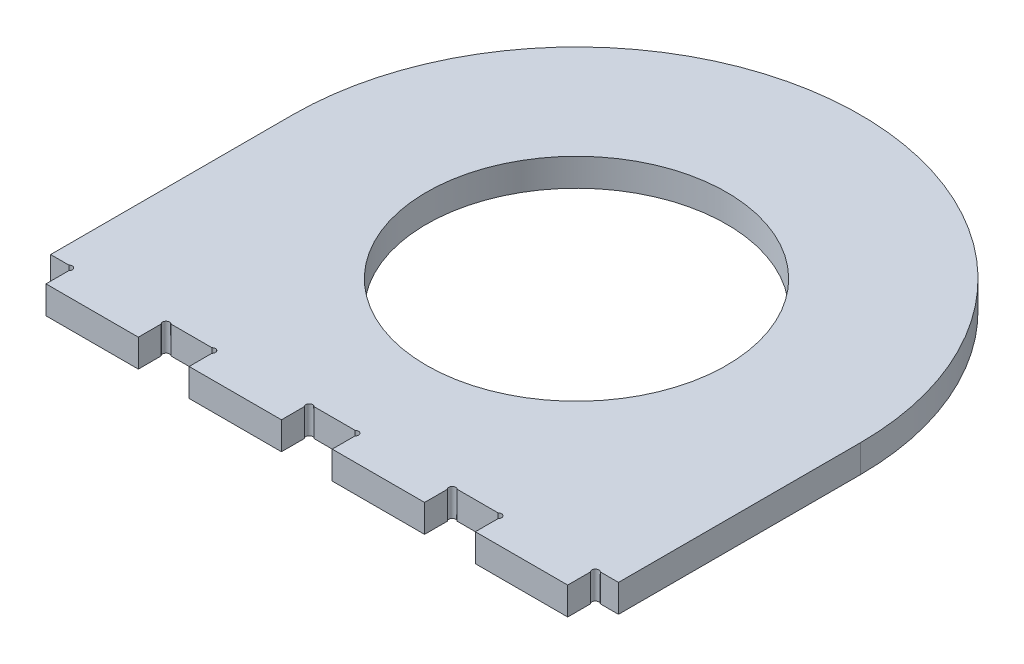
ISO-10303-21;
HEADER;
FILE_DESCRIPTION(('STEP AP214'),'2;1');
FILE_NAME('part.step','',(''),(''),'','','');
FILE_SCHEMA(('AUTOMOTIVE_DESIGN { 1 0 10303 214 1 1 1 1 }'));
ENDSEC;
DATA;
#1=APPLICATION_CONTEXT('core data for automotive mechanical design processes');
#2=APPLICATION_PROTOCOL_DEFINITION('international standard','automotive_design',2000,#1);
#3=PRODUCT_CONTEXT('',#1,'mechanical');
#4=PRODUCT('Part','Part','',(#3));
#5=PRODUCT_RELATED_PRODUCT_CATEGORY('part','',(#4));
#6=PRODUCT_DEFINITION_FORMATION('','',#4);
#7=PRODUCT_DEFINITION_CONTEXT('part definition',#1,'design');
#8=PRODUCT_DEFINITION('design','',#6,#7);
#9=PRODUCT_DEFINITION_SHAPE('','',#8);
#10=(LENGTH_UNIT() NAMED_UNIT(*) SI_UNIT(.MILLI.,.METRE.));
#11=(NAMED_UNIT(*) PLANE_ANGLE_UNIT() SI_UNIT($,.RADIAN.));
#12=(NAMED_UNIT(*) SI_UNIT($,.STERADIAN.) SOLID_ANGLE_UNIT());
#13=UNCERTAINTY_MEASURE_WITH_UNIT(LENGTH_MEASURE(1.E-05),#10,'distance_accuracy_value','');
#14=(GEOMETRIC_REPRESENTATION_CONTEXT(3) GLOBAL_UNCERTAINTY_ASSIGNED_CONTEXT((#13)) GLOBAL_UNIT_ASSIGNED_CONTEXT((#10,
#11,#12)) REPRESENTATION_CONTEXT('',''));
#15=CARTESIAN_POINT('',(0.,0.,0.));
#16=DIRECTION('',(0.,0.,1.));
#17=DIRECTION('',(1.,0.,0.));
#18=AXIS2_PLACEMENT_3D('',#15,#16,#17);
#19=CARTESIAN_POINT('',(180.,12.,-104.820295073944));
#20=DIRECTION('',(0.,1.,0.));
#21=DIRECTION('',(0.,0.,1.));
#22=AXIS2_PLACEMENT_3D('',#19,#20,#21);
#23=PLANE('',#22);
#24=DIRECTION('',(0.,0.,-1.));
#25=VECTOR('',#24,1.);
#26=CARTESIAN_POINT('',(303.,12.,0.));
#27=LINE('',#26,#25);
#28=CARTESIAN_POINT('',(303.,12.,0.));
#29=VERTEX_POINT('',#28);
#30=CARTESIAN_POINT('',(303.,12.,-104.820295073944));
#31=VERTEX_POINT('',#30);
#32=EDGE_CURVE('E304',#29,#31,#27,.T.);
#33=ORIENTED_EDGE('',*,*,#32,.T.);
#34=CARTESIAN_POINT('',(180.,12.,-104.820295073944));
#35=DIRECTION('',(0.,1.,0.));
#36=DIRECTION('',(0.,0.,1.));
#37=AXIS2_PLACEMENT_3D('',#34,#35,#36);
#38=CIRCLE('',#37,123.);
#39=CARTESIAN_POINT('',(57.,12.,-104.820295073944));
#40=VERTEX_POINT('',#39);
#41=EDGE_CURVE('E152',#31,#40,#38,.T.);
#42=ORIENTED_EDGE('',*,*,#41,.T.);
#43=DIRECTION('',(0.,0.,1.));
#44=VECTOR('',#43,1.);
#45=CARTESIAN_POINT('',(57.,12.,0.));
#46=LINE('',#45,#44);
#47=CARTESIAN_POINT('',(57.,12.,0.));
#48=VERTEX_POINT('',#47);
#49=EDGE_CURVE('E379',#40,#48,#46,.T.);
#50=ORIENTED_EDGE('',*,*,#49,.T.);
#51=DIRECTION('',(1.,0.,0.));
#52=VECTOR('',#51,1.);
#53=CARTESIAN_POINT('',(57.,12.,0.));
#54=LINE('',#53,#52);
#55=CARTESIAN_POINT('',(64.8786796564404,12.,0.));
#56=VERTEX_POINT('',#55);
#57=EDGE_CURVE('E398',#48,#56,#54,.T.);
#58=ORIENTED_EDGE('',*,*,#57,.T.);
#59=CARTESIAN_POINT('',(65.9393398282202,12.,1.06066017177982));
#60=DIRECTION('',(0.,-1.,0.));
#61=DIRECTION('',(0.,0.,1.));
#62=AXIS2_PLACEMENT_3D('',#59,#60,#61);
#63=CIRCLE('',#62,1.5);
#64=CARTESIAN_POINT('',(67.,12.,2.12132034355964));
#65=VERTEX_POINT('',#64);
#66=EDGE_CURVE('E395',#56,#65,#63,.T.);
#67=ORIENTED_EDGE('',*,*,#66,.T.);
#68=DIRECTION('',(0.,0.,1.));
#69=VECTOR('',#68,1.);
#70=CARTESIAN_POINT('',(67.,12.,2.12132034355964));
#71=LINE('',#70,#69);
#72=CARTESIAN_POINT('',(67.,12.,12.));
#73=VERTEX_POINT('',#72);
#74=EDGE_CURVE('E397',#65,#73,#71,.T.);
#75=ORIENTED_EDGE('',*,*,#74,.T.);
#76=DIRECTION('',(1.,0.,0.));
#77=VECTOR('',#76,1.);
#78=CARTESIAN_POINT('',(67.,12.,12.));
#79=LINE('',#78,#77);
#80=CARTESIAN_POINT('',(107.,12.,12.));
#81=VERTEX_POINT('',#80);
#82=EDGE_CURVE('E400',#73,#81,#79,.T.);
#83=ORIENTED_EDGE('',*,*,#82,.T.);
#84=DIRECTION('',(0.,0.,-1.));
#85=VECTOR('',#84,1.);
#86=CARTESIAN_POINT('',(107.,12.,12.));
#87=LINE('',#86,#85);
#88=CARTESIAN_POINT('',(107.,12.,2.12132034355962));
#89=VERTEX_POINT('',#88);
#90=EDGE_CURVE('E406',#81,#89,#87,.T.);
#91=ORIENTED_EDGE('',*,*,#90,.T.);
#92=CARTESIAN_POINT('',(108.06066017178,12.,1.06066017177981));
#93=DIRECTION('',(0.,-1.,0.));
#94=DIRECTION('',(0.,0.,1.));
#95=AXIS2_PLACEMENT_3D('',#92,#93,#94);
#96=CIRCLE('',#95,1.5);
#97=CARTESIAN_POINT('',(109.12132034356,12.,0.));
#98=VERTEX_POINT('',#97);
#99=EDGE_CURVE('E408',#89,#98,#96,.T.);
#100=ORIENTED_EDGE('',*,*,#99,.T.);
#101=DIRECTION('',(1.,0.,0.));
#102=VECTOR('',#101,1.);
#103=CARTESIAN_POINT('',(109.12132034356,12.,0.));
#104=LINE('',#103,#102);
#105=CARTESIAN_POINT('',(126.87867965644,12.,0.));
#106=VERTEX_POINT('',#105);
#107=EDGE_CURVE('E410',#98,#106,#104,.T.);
#108=ORIENTED_EDGE('',*,*,#107,.T.);
#109=CARTESIAN_POINT('',(127.93933982822,12.,1.06066017177981));
#110=DIRECTION('',(0.,-1.,0.));
#111=DIRECTION('',(0.,0.,1.));
#112=AXIS2_PLACEMENT_3D('',#109,#110,#111);
#113=CIRCLE('',#112,1.49999999999996);
#114=CARTESIAN_POINT('',(129.,12.,2.1213203435596));
#115=VERTEX_POINT('',#114);
#116=EDGE_CURVE('E412',#106,#115,#113,.T.);
#117=ORIENTED_EDGE('',*,*,#116,.T.);
#118=DIRECTION('',(0.,0.,1.));
#119=VECTOR('',#118,1.);
#120=CARTESIAN_POINT('',(129.,12.,2.1213203435596));
#121=LINE('',#120,#119);
#122=CARTESIAN_POINT('',(129.,12.,12.));
#123=VERTEX_POINT('',#122);
#124=EDGE_CURVE('E414',#115,#123,#121,.T.);
#125=ORIENTED_EDGE('',*,*,#124,.T.);
#126=DIRECTION('',(1.,0.,0.));
#127=VECTOR('',#126,1.);
#128=CARTESIAN_POINT('',(129.,12.,12.));
#129=LINE('',#128,#127);
#130=CARTESIAN_POINT('',(169.,12.,12.));
#131=VERTEX_POINT('',#130);
#132=EDGE_CURVE('E416',#123,#131,#129,.T.);
#133=ORIENTED_EDGE('',*,*,#132,.T.);
#134=DIRECTION('',(0.,0.,-1.));
#135=VECTOR('',#134,1.);
#136=CARTESIAN_POINT('',(169.,12.,12.));
#137=LINE('',#136,#135);
#138=CARTESIAN_POINT('',(169.,12.,2.12132034355962));
#139=VERTEX_POINT('',#138);
#140=EDGE_CURVE('E418',#131,#139,#137,.T.);
#141=ORIENTED_EDGE('',*,*,#140,.T.);
#142=CARTESIAN_POINT('',(170.06066017178,12.,1.06066017177981));
#143=DIRECTION('',(0.,-1.,0.));
#144=DIRECTION('',(0.,0.,1.));
#145=AXIS2_PLACEMENT_3D('',#142,#143,#144);
#146=CIRCLE('',#145,1.5);
#147=CARTESIAN_POINT('',(171.12132034356,12.,0.));
#148=VERTEX_POINT('',#147);
#149=EDGE_CURVE('E420',#139,#148,#146,.T.);
#150=ORIENTED_EDGE('',*,*,#149,.T.);
#151=DIRECTION('',(1.,0.,0.));
#152=VECTOR('',#151,1.);
#153=CARTESIAN_POINT('',(171.12132034356,12.,0.));
#154=LINE('',#153,#152);
#155=CARTESIAN_POINT('',(188.87867965644,12.,0.));
#156=VERTEX_POINT('',#155);
#157=EDGE_CURVE('E422',#148,#156,#154,.T.);
#158=ORIENTED_EDGE('',*,*,#157,.T.);
#159=CARTESIAN_POINT('',(189.93933982822,12.,1.06066017177981));
#160=DIRECTION('',(0.,-1.,0.));
#161=DIRECTION('',(0.,0.,1.));
#162=AXIS2_PLACEMENT_3D('',#159,#160,#161);
#163=CIRCLE('',#162,1.49999999999996);
#164=CARTESIAN_POINT('',(191.,12.,2.1213203435596));
#165=VERTEX_POINT('',#164);
#166=EDGE_CURVE('E424',#156,#165,#163,.T.);
#167=ORIENTED_EDGE('',*,*,#166,.T.);
#168=DIRECTION('',(0.,0.,1.));
#169=VECTOR('',#168,1.);
#170=CARTESIAN_POINT('',(191.,12.,2.1213203435596));
#171=LINE('',#170,#169);
#172=CARTESIAN_POINT('',(191.,12.,12.));
#173=VERTEX_POINT('',#172);
#174=EDGE_CURVE('E426',#165,#173,#171,.T.);
#175=ORIENTED_EDGE('',*,*,#174,.T.);
#176=DIRECTION('',(1.,0.,0.));
#177=VECTOR('',#176,1.);
#178=CARTESIAN_POINT('',(191.,12.,12.));
#179=LINE('',#178,#177);
#180=CARTESIAN_POINT('',(231.,12.,12.));
#181=VERTEX_POINT('',#180);
#182=EDGE_CURVE('E428',#173,#181,#179,.T.);
#183=ORIENTED_EDGE('',*,*,#182,.T.);
#184=DIRECTION('',(0.,0.,-1.));
#185=VECTOR('',#184,1.);
#186=CARTESIAN_POINT('',(231.,12.,12.));
#187=LINE('',#186,#185);
#188=CARTESIAN_POINT('',(231.,12.,2.12132034355962));
#189=VERTEX_POINT('',#188);
#190=EDGE_CURVE('E430',#181,#189,#187,.T.);
#191=ORIENTED_EDGE('',*,*,#190,.T.);
#192=CARTESIAN_POINT('',(232.06066017178,12.,1.06066017177981));
#193=DIRECTION('',(0.,-1.,0.));
#194=DIRECTION('',(0.,0.,1.));
#195=AXIS2_PLACEMENT_3D('',#192,#193,#194);
#196=CIRCLE('',#195,1.5);
#197=CARTESIAN_POINT('',(233.12132034356,12.,0.));
#198=VERTEX_POINT('',#197);
#199=EDGE_CURVE('E432',#189,#198,#196,.T.);
#200=ORIENTED_EDGE('',*,*,#199,.T.);
#201=DIRECTION('',(1.,0.,0.));
#202=VECTOR('',#201,1.);
#203=CARTESIAN_POINT('',(233.12132034356,12.,0.));
#204=LINE('',#203,#202);
#205=CARTESIAN_POINT('',(250.87867965644,12.,0.));
#206=VERTEX_POINT('',#205);
#207=EDGE_CURVE('E434',#198,#206,#204,.T.);
#208=ORIENTED_EDGE('',*,*,#207,.T.);
#209=CARTESIAN_POINT('',(251.93933982822,12.,1.06066017177981));
#210=DIRECTION('',(0.,-1.,0.));
#211=DIRECTION('',(0.,0.,1.));
#212=AXIS2_PLACEMENT_3D('',#209,#210,#211);
#213=CIRCLE('',#212,1.49999999999997);
#214=CARTESIAN_POINT('',(253.,12.,2.1213203435596));
#215=VERTEX_POINT('',#214);
#216=EDGE_CURVE('E436',#206,#215,#213,.T.);
#217=ORIENTED_EDGE('',*,*,#216,.T.);
#218=DIRECTION('',(0.,0.,1.));
#219=VECTOR('',#218,1.);
#220=CARTESIAN_POINT('',(253.,12.,2.1213203435596));
#221=LINE('',#220,#219);
#222=CARTESIAN_POINT('',(253.,12.,12.));
#223=VERTEX_POINT('',#222);
#224=EDGE_CURVE('E438',#215,#223,#221,.T.);
#225=ORIENTED_EDGE('',*,*,#224,.T.);
#226=DIRECTION('',(1.,0.,0.));
#227=VECTOR('',#226,1.);
#228=CARTESIAN_POINT('',(253.,12.,12.));
#229=LINE('',#228,#227);
#230=CARTESIAN_POINT('',(293.,12.,12.));
#231=VERTEX_POINT('',#230);
#232=EDGE_CURVE('E231',#223,#231,#229,.T.);
#233=ORIENTED_EDGE('',*,*,#232,.T.);
#234=DIRECTION('',(0.,0.,-1.));
#235=VECTOR('',#234,1.);
#236=CARTESIAN_POINT('',(293.,12.,12.));
#237=LINE('',#236,#235);
#238=CARTESIAN_POINT('',(293.,12.,2.12132034355962));
#239=VERTEX_POINT('',#238);
#240=EDGE_CURVE('E225',#231,#239,#237,.T.);
#241=ORIENTED_EDGE('',*,*,#240,.T.);
#242=CARTESIAN_POINT('',(294.06066017178,12.,1.06066017177981));
#243=DIRECTION('',(0.,-1.,0.));
#244=DIRECTION('',(0.,0.,1.));
#245=AXIS2_PLACEMENT_3D('',#242,#243,#244);
#246=CIRCLE('',#245,1.50000000000002);
#247=CARTESIAN_POINT('',(295.12132034356,12.,0.));
#248=VERTEX_POINT('',#247);
#249=EDGE_CURVE('E229',#239,#248,#246,.T.);
#250=ORIENTED_EDGE('',*,*,#249,.T.);
#251=DIRECTION('',(1.,0.,0.));
#252=VECTOR('',#251,1.);
#253=CARTESIAN_POINT('',(295.12132034356,12.,0.));
#254=LINE('',#253,#252);
#255=EDGE_CURVE('E49',#248,#29,#254,.T.);
#256=ORIENTED_EDGE('',*,*,#255,.T.);
#257=EDGE_LOOP('',(#33,#42,#50,#58,#67,#75,#83,#91,#100,#108,#117,#125,#133,#141,#150,#158,#167,
#175,#183,#191,#200,#208,#217,#225,#233,#241,#250,#256));
#258=FACE_BOUND('',#257,.T.);
#259=CARTESIAN_POINT('',(180.,12.,-104.820295073944));
#260=DIRECTION('',(0.,1.,0.));
#261=DIRECTION('',(0.,0.,1.));
#262=AXIS2_PLACEMENT_3D('',#259,#260,#261);
#263=CIRCLE('',#262,65.);
#264=CARTESIAN_POINT('',(180.,12.,-39.8202950739442));
#265=VERTEX_POINT('',#264);
#266=EDGE_CURVE('E253',#265,#265,#263,.T.);
#267=ORIENTED_EDGE('',*,*,#266,.F.);
#268=EDGE_LOOP('',(#267));
#269=FACE_BOUND('',#268,.T.);
#270=ADVANCED_FACE('F32',(#258,#269),#23,.T.);
#271=CARTESIAN_POINT('',(180.,0.,-104.820295073944));
#272=DIRECTION('',(0.,1.,0.));
#273=DIRECTION('',(0.,0.,1.));
#274=AXIS2_PLACEMENT_3D('',#271,#272,#273);
#275=PLANE('',#274);
#276=DIRECTION('',(0.,0.,-1.));
#277=VECTOR('',#276,1.);
#278=CARTESIAN_POINT('',(303.,0.,0.));
#279=LINE('',#278,#277);
#280=CARTESIAN_POINT('',(303.,0.,0.));
#281=VERTEX_POINT('',#280);
#282=CARTESIAN_POINT('',(303.,0.,-104.820295073944));
#283=VERTEX_POINT('',#282);
#284=EDGE_CURVE('E249',#281,#283,#279,.T.);
#285=ORIENTED_EDGE('',*,*,#284,.F.);
#286=DIRECTION('',(1.,0.,0.));
#287=VECTOR('',#286,1.);
#288=CARTESIAN_POINT('',(295.12132034356,0.,0.));
#289=LINE('',#288,#287);
#290=CARTESIAN_POINT('',(295.12132034356,0.,0.));
#291=VERTEX_POINT('',#290);
#292=EDGE_CURVE('E144',#291,#281,#289,.T.);
#293=ORIENTED_EDGE('',*,*,#292,.F.);
#294=CARTESIAN_POINT('',(294.06066017178,0.,1.06066017177981));
#295=DIRECTION('',(0.,-1.,0.));
#296=DIRECTION('',(0.,0.,1.));
#297=AXIS2_PLACEMENT_3D('',#294,#295,#296);
#298=CIRCLE('',#297,1.50000000000002);
#299=CARTESIAN_POINT('',(293.,0.,2.12132034355962));
#300=VERTEX_POINT('',#299);
#301=EDGE_CURVE('E138',#300,#291,#298,.T.);
#302=ORIENTED_EDGE('',*,*,#301,.F.);
#303=DIRECTION('',(0.,0.,-1.));
#304=VECTOR('',#303,1.);
#305=CARTESIAN_POINT('',(293.,0.,12.));
#306=LINE('',#305,#304);
#307=CARTESIAN_POINT('',(293.,0.,12.));
#308=VERTEX_POINT('',#307);
#309=EDGE_CURVE('E239',#308,#300,#306,.T.);
#310=ORIENTED_EDGE('',*,*,#309,.F.);
#311=DIRECTION('',(1.,0.,0.));
#312=VECTOR('',#311,1.);
#313=CARTESIAN_POINT('',(253.,0.,12.));
#314=LINE('',#313,#312);
#315=CARTESIAN_POINT('',(253.,0.,12.));
#316=VERTEX_POINT('',#315);
#317=EDGE_CURVE('E299',#316,#308,#314,.T.);
#318=ORIENTED_EDGE('',*,*,#317,.F.);
#319=DIRECTION('',(0.,0.,1.));
#320=VECTOR('',#319,1.);
#321=CARTESIAN_POINT('',(253.,0.,2.1213203435596));
#322=LINE('',#321,#320);
#323=CARTESIAN_POINT('',(253.,0.,2.1213203435596));
#324=VERTEX_POINT('',#323);
#325=EDGE_CURVE('E297',#324,#316,#322,.T.);
#326=ORIENTED_EDGE('',*,*,#325,.F.);
#327=CARTESIAN_POINT('',(251.93933982822,0.,1.06066017177981));
#328=DIRECTION('',(0.,-1.,0.));
#329=DIRECTION('',(0.,0.,1.));
#330=AXIS2_PLACEMENT_3D('',#327,#328,#329);
#331=CIRCLE('',#330,1.49999999999997);
#332=CARTESIAN_POINT('',(250.87867965644,0.,0.));
#333=VERTEX_POINT('',#332);
#334=EDGE_CURVE('E295',#333,#324,#331,.T.);
#335=ORIENTED_EDGE('',*,*,#334,.F.);
#336=DIRECTION('',(1.,0.,0.));
#337=VECTOR('',#336,1.);
#338=CARTESIAN_POINT('',(233.12132034356,0.,0.));
#339=LINE('',#338,#337);
#340=CARTESIAN_POINT('',(233.12132034356,0.,0.));
#341=VERTEX_POINT('',#340);
#342=EDGE_CURVE('E293',#341,#333,#339,.T.);
#343=ORIENTED_EDGE('',*,*,#342,.F.);
#344=CARTESIAN_POINT('',(232.06066017178,0.,1.06066017177981));
#345=DIRECTION('',(0.,-1.,0.));
#346=DIRECTION('',(0.,0.,1.));
#347=AXIS2_PLACEMENT_3D('',#344,#345,#346);
#348=CIRCLE('',#347,1.5);
#349=CARTESIAN_POINT('',(231.,0.,2.12132034355962));
#350=VERTEX_POINT('',#349);
#351=EDGE_CURVE('E291',#350,#341,#348,.T.);
#352=ORIENTED_EDGE('',*,*,#351,.F.);
#353=DIRECTION('',(0.,0.,-1.));
#354=VECTOR('',#353,1.);
#355=CARTESIAN_POINT('',(231.,0.,12.));
#356=LINE('',#355,#354);
#357=CARTESIAN_POINT('',(231.,0.,12.));
#358=VERTEX_POINT('',#357);
#359=EDGE_CURVE('E289',#358,#350,#356,.T.);
#360=ORIENTED_EDGE('',*,*,#359,.F.);
#361=DIRECTION('',(1.,0.,0.));
#362=VECTOR('',#361,1.);
#363=CARTESIAN_POINT('',(191.,0.,12.));
#364=LINE('',#363,#362);
#365=CARTESIAN_POINT('',(191.,0.,12.));
#366=VERTEX_POINT('',#365);
#367=EDGE_CURVE('E287',#366,#358,#364,.T.);
#368=ORIENTED_EDGE('',*,*,#367,.F.);
#369=DIRECTION('',(0.,0.,1.));
#370=VECTOR('',#369,1.);
#371=CARTESIAN_POINT('',(191.,0.,2.1213203435596));
#372=LINE('',#371,#370);
#373=CARTESIAN_POINT('',(191.,0.,2.1213203435596));
#374=VERTEX_POINT('',#373);
#375=EDGE_CURVE('E285',#374,#366,#372,.T.);
#376=ORIENTED_EDGE('',*,*,#375,.F.);
#377=CARTESIAN_POINT('',(189.93933982822,0.,1.06066017177981));
#378=DIRECTION('',(0.,-1.,0.));
#379=DIRECTION('',(0.,0.,1.));
#380=AXIS2_PLACEMENT_3D('',#377,#378,#379);
#381=CIRCLE('',#380,1.49999999999996);
#382=CARTESIAN_POINT('',(188.87867965644,0.,0.));
#383=VERTEX_POINT('',#382);
#384=EDGE_CURVE('E283',#383,#374,#381,.T.);
#385=ORIENTED_EDGE('',*,*,#384,.F.);
#386=DIRECTION('',(1.,0.,0.));
#387=VECTOR('',#386,1.);
#388=CARTESIAN_POINT('',(171.12132034356,0.,0.));
#389=LINE('',#388,#387);
#390=CARTESIAN_POINT('',(171.12132034356,0.,0.));
#391=VERTEX_POINT('',#390);
#392=EDGE_CURVE('E281',#391,#383,#389,.T.);
#393=ORIENTED_EDGE('',*,*,#392,.F.);
#394=CARTESIAN_POINT('',(170.06066017178,0.,1.06066017177981));
#395=DIRECTION('',(0.,-1.,0.));
#396=DIRECTION('',(0.,0.,1.));
#397=AXIS2_PLACEMENT_3D('',#394,#395,#396);
#398=CIRCLE('',#397,1.5);
#399=CARTESIAN_POINT('',(169.,0.,2.12132034355962));
#400=VERTEX_POINT('',#399);
#401=EDGE_CURVE('E279',#400,#391,#398,.T.);
#402=ORIENTED_EDGE('',*,*,#401,.F.);
#403=DIRECTION('',(0.,0.,-1.));
#404=VECTOR('',#403,1.);
#405=CARTESIAN_POINT('',(169.,0.,12.));
#406=LINE('',#405,#404);
#407=CARTESIAN_POINT('',(169.,0.,12.));
#408=VERTEX_POINT('',#407);
#409=EDGE_CURVE('E277',#408,#400,#406,.T.);
#410=ORIENTED_EDGE('',*,*,#409,.F.);
#411=DIRECTION('',(1.,0.,0.));
#412=VECTOR('',#411,1.);
#413=CARTESIAN_POINT('',(129.,0.,12.));
#414=LINE('',#413,#412);
#415=CARTESIAN_POINT('',(129.,0.,12.));
#416=VERTEX_POINT('',#415);
#417=EDGE_CURVE('E275',#416,#408,#414,.T.);
#418=ORIENTED_EDGE('',*,*,#417,.F.);
#419=DIRECTION('',(0.,0.,1.));
#420=VECTOR('',#419,1.);
#421=CARTESIAN_POINT('',(129.,0.,2.1213203435596));
#422=LINE('',#421,#420);
#423=CARTESIAN_POINT('',(129.,0.,2.1213203435596));
#424=VERTEX_POINT('',#423);
#425=EDGE_CURVE('E273',#424,#416,#422,.T.);
#426=ORIENTED_EDGE('',*,*,#425,.F.);
#427=CARTESIAN_POINT('',(127.93933982822,0.,1.06066017177981));
#428=DIRECTION('',(0.,-1.,0.));
#429=DIRECTION('',(0.,0.,1.));
#430=AXIS2_PLACEMENT_3D('',#427,#428,#429);
#431=CIRCLE('',#430,1.49999999999996);
#432=CARTESIAN_POINT('',(126.87867965644,0.,0.));
#433=VERTEX_POINT('',#432);
#434=EDGE_CURVE('E271',#433,#424,#431,.T.);
#435=ORIENTED_EDGE('',*,*,#434,.F.);
#436=DIRECTION('',(1.,0.,0.));
#437=VECTOR('',#436,1.);
#438=CARTESIAN_POINT('',(109.12132034356,0.,0.));
#439=LINE('',#438,#437);
#440=CARTESIAN_POINT('',(109.12132034356,0.,0.));
#441=VERTEX_POINT('',#440);
#442=EDGE_CURVE('E269',#441,#433,#439,.T.);
#443=ORIENTED_EDGE('',*,*,#442,.F.);
#444=CARTESIAN_POINT('',(108.06066017178,0.,1.06066017177981));
#445=DIRECTION('',(0.,-1.,0.));
#446=DIRECTION('',(0.,0.,1.));
#447=AXIS2_PLACEMENT_3D('',#444,#445,#446);
#448=CIRCLE('',#447,1.5);
#449=CARTESIAN_POINT('',(107.,0.,2.12132034355962));
#450=VERTEX_POINT('',#449);
#451=EDGE_CURVE('E267',#450,#441,#448,.T.);
#452=ORIENTED_EDGE('',*,*,#451,.F.);
#453=DIRECTION('',(0.,0.,-1.));
#454=VECTOR('',#453,1.);
#455=CARTESIAN_POINT('',(107.,0.,12.));
#456=LINE('',#455,#454);
#457=CARTESIAN_POINT('',(107.,0.,12.));
#458=VERTEX_POINT('',#457);
#459=EDGE_CURVE('E265',#458,#450,#456,.T.);
#460=ORIENTED_EDGE('',*,*,#459,.F.);
#461=DIRECTION('',(1.,0.,0.));
#462=VECTOR('',#461,1.);
#463=CARTESIAN_POINT('',(67.,0.,12.));
#464=LINE('',#463,#462);
#465=CARTESIAN_POINT('',(67.,0.,12.));
#466=VERTEX_POINT('',#465);
#467=EDGE_CURVE('E263',#466,#458,#464,.T.);
#468=ORIENTED_EDGE('',*,*,#467,.F.);
#469=DIRECTION('',(0.,0.,1.));
#470=VECTOR('',#469,1.);
#471=CARTESIAN_POINT('',(67.,0.,2.12132034355964));
#472=LINE('',#471,#470);
#473=CARTESIAN_POINT('',(67.,0.,2.12132034355964));
#474=VERTEX_POINT('',#473);
#475=EDGE_CURVE('E261',#474,#466,#472,.T.);
#476=ORIENTED_EDGE('',*,*,#475,.F.);
#477=CARTESIAN_POINT('',(65.9393398282202,0.,1.06066017177982));
#478=DIRECTION('',(0.,-1.,0.));
#479=DIRECTION('',(0.,0.,1.));
#480=AXIS2_PLACEMENT_3D('',#477,#478,#479);
#481=CIRCLE('',#480,1.5);
#482=CARTESIAN_POINT('',(64.8786796564404,0.,0.));
#483=VERTEX_POINT('',#482);
#484=EDGE_CURVE('E259',#483,#474,#481,.T.);
#485=ORIENTED_EDGE('',*,*,#484,.F.);
#486=DIRECTION('',(1.,0.,0.));
#487=VECTOR('',#486,1.);
#488=CARTESIAN_POINT('',(57.,0.,0.));
#489=LINE('',#488,#487);
#490=CARTESIAN_POINT('',(57.,0.,0.));
#491=VERTEX_POINT('',#490);
#492=EDGE_CURVE('E257',#491,#483,#489,.T.);
#493=ORIENTED_EDGE('',*,*,#492,.F.);
#494=DIRECTION('',(0.,0.,1.));
#495=VECTOR('',#494,1.);
#496=CARTESIAN_POINT('',(57.,0.,0.));
#497=LINE('',#496,#495);
#498=CARTESIAN_POINT('',(57.,0.,-104.820295073944));
#499=VERTEX_POINT('',#498);
#500=EDGE_CURVE('E255',#499,#491,#497,.T.);
#501=ORIENTED_EDGE('',*,*,#500,.F.);
#502=CARTESIAN_POINT('',(180.,0.,-104.820295073944));
#503=DIRECTION('',(0.,1.,0.));
#504=DIRECTION('',(0.,0.,1.));
#505=AXIS2_PLACEMENT_3D('',#502,#503,#504);
#506=CIRCLE('',#505,123.);
#507=EDGE_CURVE('E252',#283,#499,#506,.T.);
#508=ORIENTED_EDGE('',*,*,#507,.F.);
#509=EDGE_LOOP('',(#285,#293,#302,#310,#318,#326,#335,#343,#352,#360,#368,#376,#385,#393,#402,
#410,#418,#426,#435,#443,#452,#460,#468,#476,#485,#493,#501,#508));
#510=FACE_BOUND('',#509,.T.);
#511=CARTESIAN_POINT('',(180.,0.,-104.820295073944));
#512=DIRECTION('',(0.,1.,0.));
#513=DIRECTION('',(0.,0.,1.));
#514=AXIS2_PLACEMENT_3D('',#511,#512,#513);
#515=CIRCLE('',#514,65.);
#516=CARTESIAN_POINT('',(180.,0.,-39.8202950739442));
#517=VERTEX_POINT('',#516);
#518=EDGE_CURVE('E793',#517,#517,#515,.T.);
#519=ORIENTED_EDGE('',*,*,#518,.T.);
#520=EDGE_LOOP('',(#519));
#521=FACE_BOUND('',#520,.T.);
#522=ADVANCED_FACE('F383',(#510,#521),#275,.F.);
#523=CARTESIAN_POINT('',(303.,12.,0.));
#524=DIRECTION('',(-1.,0.,0.));
#525=DIRECTION('',(0.,0.,1.));
#526=AXIS2_PLACEMENT_3D('',#523,#524,#525);
#527=PLANE('',#526);
#528=ORIENTED_EDGE('',*,*,#284,.T.);
#529=DIRECTION('',(0.,-1.,0.));
#530=VECTOR('',#529,1.);
#531=CARTESIAN_POINT('',(303.,12.,-104.820295073944));
#532=LINE('',#531,#530);
#533=EDGE_CURVE('E11',#31,#283,#532,.T.);
#534=ORIENTED_EDGE('',*,*,#533,.F.);
#535=ORIENTED_EDGE('',*,*,#32,.F.);
#536=DIRECTION('',(0.,-1.,0.));
#537=VECTOR('',#536,1.);
#538=CARTESIAN_POINT('',(303.,12.,0.));
#539=LINE('',#538,#537);
#540=EDGE_CURVE('E245',#29,#281,#539,.T.);
#541=ORIENTED_EDGE('',*,*,#540,.T.);
#542=EDGE_LOOP('',(#528,#534,#535,#541));
#543=FACE_BOUND('',#542,.T.);
#544=ADVANCED_FACE('F34',(#543),#527,.F.);
#545=CARTESIAN_POINT('',(180.,12.,-104.820295073944));
#546=DIRECTION('',(0.,-1.,0.));
#547=DIRECTION('',(0.,0.,-1.));
#548=AXIS2_PLACEMENT_3D('',#545,#546,#547);
#549=CYLINDRICAL_SURFACE('',#548,123.);
#550=ORIENTED_EDGE('',*,*,#507,.T.);
#551=DIRECTION('',(0.,-1.,0.));
#552=VECTOR('',#551,1.);
#553=CARTESIAN_POINT('',(57.,12.,-104.820295073944));
#554=LINE('',#553,#552);
#555=EDGE_CURVE('E41',#40,#499,#554,.T.);
#556=ORIENTED_EDGE('',*,*,#555,.F.);
#557=ORIENTED_EDGE('',*,*,#41,.F.);
#558=ORIENTED_EDGE('',*,*,#533,.T.);
#559=EDGE_LOOP('',(#550,#556,#557,#558));
#560=FACE_BOUND('',#559,.T.);
#561=ADVANCED_FACE('F472',(#560),#549,.T.);
#562=CARTESIAN_POINT('',(57.,12.,0.));
#563=DIRECTION('',(1.,0.,0.));
#564=DIRECTION('',(0.,0.,-1.));
#565=AXIS2_PLACEMENT_3D('',#562,#563,#564);
#566=PLANE('',#565);
#567=ORIENTED_EDGE('',*,*,#500,.T.);
#568=DIRECTION('',(0.,-1.,0.));
#569=VECTOR('',#568,1.);
#570=CARTESIAN_POINT('',(57.,12.,0.));
#571=LINE('',#570,#569);
#572=EDGE_CURVE('E371',#48,#491,#571,.T.);
#573=ORIENTED_EDGE('',*,*,#572,.F.);
#574=ORIENTED_EDGE('',*,*,#49,.F.);
#575=ORIENTED_EDGE('',*,*,#555,.T.);
#576=EDGE_LOOP('',(#567,#573,#574,#575));
#577=FACE_BOUND('',#576,.T.);
#578=ADVANCED_FACE('F377',(#577),#566,.F.);
#579=CARTESIAN_POINT('',(57.,12.,0.));
#580=DIRECTION('',(0.,0.,-1.));
#581=DIRECTION('',(-1.,0.,0.));
#582=AXIS2_PLACEMENT_3D('',#579,#580,#581);
#583=PLANE('',#582);
#584=ORIENTED_EDGE('',*,*,#492,.T.);
#585=DIRECTION('',(0.,-1.,0.));
#586=VECTOR('',#585,1.);
#587=CARTESIAN_POINT('',(64.8786796564404,12.,0.));
#588=LINE('',#587,#586);
#589=EDGE_CURVE('E368',#56,#483,#588,.T.);
#590=ORIENTED_EDGE('',*,*,#589,.F.);
#591=ORIENTED_EDGE('',*,*,#57,.F.);
#592=ORIENTED_EDGE('',*,*,#572,.T.);
#593=EDGE_LOOP('',(#584,#590,#591,#592));
#594=FACE_BOUND('',#593,.T.);
#595=ADVANCED_FACE('F389',(#594),#583,.F.);
#596=CARTESIAN_POINT('',(65.9393398282202,12.,1.06066017177982));
#597=DIRECTION('',(0.,-1.,0.));
#598=DIRECTION('',(0.,0.,-1.));
#599=AXIS2_PLACEMENT_3D('',#596,#597,#598);
#600=CYLINDRICAL_SURFACE('',#599,1.5);
#601=ORIENTED_EDGE('',*,*,#484,.T.);
#602=DIRECTION('',(0.,-1.,0.));
#603=VECTOR('',#602,1.);
#604=CARTESIAN_POINT('',(67.,12.,2.12132034355964));
#605=LINE('',#604,#603);
#606=EDGE_CURVE('E365',#65,#474,#605,.T.);
#607=ORIENTED_EDGE('',*,*,#606,.F.);
#608=ORIENTED_EDGE('',*,*,#66,.F.);
#609=ORIENTED_EDGE('',*,*,#589,.T.);
#610=EDGE_LOOP('',(#601,#607,#608,#609));
#611=FACE_BOUND('',#610,.T.);
#612=ADVANCED_FACE('F393',(#611),#600,.F.);
#613=CARTESIAN_POINT('',(67.,12.,2.12132034355964));
#614=DIRECTION('',(1.,0.,0.));
#615=DIRECTION('',(0.,0.,-1.));
#616=AXIS2_PLACEMENT_3D('',#613,#614,#615);
#617=PLANE('',#616);
#618=ORIENTED_EDGE('',*,*,#475,.T.);
#619=DIRECTION('',(0.,-1.,0.));
#620=VECTOR('',#619,1.);
#621=CARTESIAN_POINT('',(67.,12.,12.));
#622=LINE('',#621,#620);
#623=EDGE_CURVE('E362',#73,#466,#622,.T.);
#624=ORIENTED_EDGE('',*,*,#623,.F.);
#625=ORIENTED_EDGE('',*,*,#74,.F.);
#626=ORIENTED_EDGE('',*,*,#606,.T.);
#627=EDGE_LOOP('',(#618,#624,#625,#626));
#628=FACE_BOUND('',#627,.T.);
#629=ADVANCED_FACE('F485',(#628),#617,.F.);
#630=CARTESIAN_POINT('',(67.,12.,12.));
#631=DIRECTION('',(0.,0.,-1.));
#632=DIRECTION('',(-1.,0.,0.));
#633=AXIS2_PLACEMENT_3D('',#630,#631,#632);
#634=PLANE('',#633);
#635=ORIENTED_EDGE('',*,*,#467,.T.);
#636=DIRECTION('',(0.,-1.,0.));
#637=VECTOR('',#636,1.);
#638=CARTESIAN_POINT('',(107.,12.,12.));
#639=LINE('',#638,#637);
#640=EDGE_CURVE('E359',#81,#458,#639,.T.);
#641=ORIENTED_EDGE('',*,*,#640,.F.);
#642=ORIENTED_EDGE('',*,*,#82,.F.);
#643=ORIENTED_EDGE('',*,*,#623,.T.);
#644=EDGE_LOOP('',(#635,#641,#642,#643));
#645=FACE_BOUND('',#644,.T.);
#646=ADVANCED_FACE('F488',(#645),#634,.F.);
#647=CARTESIAN_POINT('',(107.,12.,12.));
#648=DIRECTION('',(-1.,0.,0.));
#649=DIRECTION('',(0.,0.,1.));
#650=AXIS2_PLACEMENT_3D('',#647,#648,#649);
#651=PLANE('',#650);
#652=ORIENTED_EDGE('',*,*,#459,.T.);
#653=DIRECTION('',(0.,-1.,0.));
#654=VECTOR('',#653,1.);
#655=CARTESIAN_POINT('',(107.,12.,2.12132034355962));
#656=LINE('',#655,#654);
#657=EDGE_CURVE('E356',#89,#450,#656,.T.);
#658=ORIENTED_EDGE('',*,*,#657,.F.);
#659=ORIENTED_EDGE('',*,*,#90,.F.);
#660=ORIENTED_EDGE('',*,*,#640,.T.);
#661=EDGE_LOOP('',(#652,#658,#659,#660));
#662=FACE_BOUND('',#661,.T.);
#663=ADVANCED_FACE('F492',(#662),#651,.F.);
#664=CARTESIAN_POINT('',(108.06066017178,12.,1.06066017177981));
#665=DIRECTION('',(0.,-1.,0.));
#666=DIRECTION('',(0.,0.,-1.));
#667=AXIS2_PLACEMENT_3D('',#664,#665,#666);
#668=CYLINDRICAL_SURFACE('',#667,1.5);
#669=ORIENTED_EDGE('',*,*,#451,.T.);
#670=DIRECTION('',(0.,-1.,0.));
#671=VECTOR('',#670,1.);
#672=CARTESIAN_POINT('',(109.12132034356,12.,0.));
#673=LINE('',#672,#671);
#674=EDGE_CURVE('E353',#98,#441,#673,.T.);
#675=ORIENTED_EDGE('',*,*,#674,.F.);
#676=ORIENTED_EDGE('',*,*,#99,.F.);
#677=ORIENTED_EDGE('',*,*,#657,.T.);
#678=EDGE_LOOP('',(#669,#675,#676,#677));
#679=FACE_BOUND('',#678,.T.);
#680=ADVANCED_FACE('F496',(#679),#668,.F.);
#681=CARTESIAN_POINT('',(109.12132034356,12.,0.));
#682=DIRECTION('',(0.,0.,-1.));
#683=DIRECTION('',(-1.,0.,0.));
#684=AXIS2_PLACEMENT_3D('',#681,#682,#683);
#685=PLANE('',#684);
#686=ORIENTED_EDGE('',*,*,#442,.T.);
#687=DIRECTION('',(0.,-1.,0.));
#688=VECTOR('',#687,1.);
#689=CARTESIAN_POINT('',(126.87867965644,12.,0.));
#690=LINE('',#689,#688);
#691=EDGE_CURVE('E350',#106,#433,#690,.T.);
#692=ORIENTED_EDGE('',*,*,#691,.F.);
#693=ORIENTED_EDGE('',*,*,#107,.F.);
#694=ORIENTED_EDGE('',*,*,#674,.T.);
#695=EDGE_LOOP('',(#686,#692,#693,#694));
#696=FACE_BOUND('',#695,.T.);
#697=ADVANCED_FACE('F500',(#696),#685,.F.);
#698=CARTESIAN_POINT('',(127.93933982822,12.,1.06066017177981));
#699=DIRECTION('',(0.,-1.,0.));
#700=DIRECTION('',(0.,0.,-1.));
#701=AXIS2_PLACEMENT_3D('',#698,#699,#700);
#702=CYLINDRICAL_SURFACE('',#701,1.49999999999996);
#703=ORIENTED_EDGE('',*,*,#434,.T.);
#704=DIRECTION('',(0.,-1.,0.));
#705=VECTOR('',#704,1.);
#706=CARTESIAN_POINT('',(129.,12.,2.1213203435596));
#707=LINE('',#706,#705);
#708=EDGE_CURVE('E347',#115,#424,#707,.T.);
#709=ORIENTED_EDGE('',*,*,#708,.F.);
#710=ORIENTED_EDGE('',*,*,#116,.F.);
#711=ORIENTED_EDGE('',*,*,#691,.T.);
#712=EDGE_LOOP('',(#703,#709,#710,#711));
#713=FACE_BOUND('',#712,.T.);
#714=ADVANCED_FACE('F504',(#713),#702,.F.);
#715=CARTESIAN_POINT('',(129.,12.,2.1213203435596));
#716=DIRECTION('',(1.,0.,0.));
#717=DIRECTION('',(0.,0.,-1.));
#718=AXIS2_PLACEMENT_3D('',#715,#716,#717);
#719=PLANE('',#718);
#720=ORIENTED_EDGE('',*,*,#425,.T.);
#721=DIRECTION('',(0.,-1.,0.));
#722=VECTOR('',#721,1.);
#723=CARTESIAN_POINT('',(129.,12.,12.));
#724=LINE('',#723,#722);
#725=EDGE_CURVE('E344',#123,#416,#724,.T.);
#726=ORIENTED_EDGE('',*,*,#725,.F.);
#727=ORIENTED_EDGE('',*,*,#124,.F.);
#728=ORIENTED_EDGE('',*,*,#708,.T.);
#729=EDGE_LOOP('',(#720,#726,#727,#728));
#730=FACE_BOUND('',#729,.T.);
#731=ADVANCED_FACE('F508',(#730),#719,.F.);
#732=CARTESIAN_POINT('',(129.,12.,12.));
#733=DIRECTION('',(0.,0.,-1.));
#734=DIRECTION('',(-1.,0.,0.));
#735=AXIS2_PLACEMENT_3D('',#732,#733,#734);
#736=PLANE('',#735);
#737=ORIENTED_EDGE('',*,*,#417,.T.);
#738=DIRECTION('',(0.,-1.,0.));
#739=VECTOR('',#738,1.);
#740=CARTESIAN_POINT('',(169.,12.,12.));
#741=LINE('',#740,#739);
#742=EDGE_CURVE('E341',#131,#408,#741,.T.);
#743=ORIENTED_EDGE('',*,*,#742,.F.);
#744=ORIENTED_EDGE('',*,*,#132,.F.);
#745=ORIENTED_EDGE('',*,*,#725,.T.);
#746=EDGE_LOOP('',(#737,#743,#744,#745));
#747=FACE_BOUND('',#746,.T.);
#748=ADVANCED_FACE('F512',(#747),#736,.F.);
#749=CARTESIAN_POINT('',(169.,12.,12.));
#750=DIRECTION('',(-1.,0.,0.));
#751=DIRECTION('',(0.,0.,1.));
#752=AXIS2_PLACEMENT_3D('',#749,#750,#751);
#753=PLANE('',#752);
#754=ORIENTED_EDGE('',*,*,#409,.T.);
#755=DIRECTION('',(0.,-1.,0.));
#756=VECTOR('',#755,1.);
#757=CARTESIAN_POINT('',(169.,12.,2.12132034355962));
#758=LINE('',#757,#756);
#759=EDGE_CURVE('E338',#139,#400,#758,.T.);
#760=ORIENTED_EDGE('',*,*,#759,.F.);
#761=ORIENTED_EDGE('',*,*,#140,.F.);
#762=ORIENTED_EDGE('',*,*,#742,.T.);
#763=EDGE_LOOP('',(#754,#760,#761,#762));
#764=FACE_BOUND('',#763,.T.);
#765=ADVANCED_FACE('F516',(#764),#753,.F.);
#766=CARTESIAN_POINT('',(170.06066017178,12.,1.06066017177981));
#767=DIRECTION('',(0.,-1.,0.));
#768=DIRECTION('',(0.,0.,-1.));
#769=AXIS2_PLACEMENT_3D('',#766,#767,#768);
#770=CYLINDRICAL_SURFACE('',#769,1.5);
#771=ORIENTED_EDGE('',*,*,#401,.T.);
#772=DIRECTION('',(0.,-1.,0.));
#773=VECTOR('',#772,1.);
#774=CARTESIAN_POINT('',(171.12132034356,12.,0.));
#775=LINE('',#774,#773);
#776=EDGE_CURVE('E335',#148,#391,#775,.T.);
#777=ORIENTED_EDGE('',*,*,#776,.F.);
#778=ORIENTED_EDGE('',*,*,#149,.F.);
#779=ORIENTED_EDGE('',*,*,#759,.T.);
#780=EDGE_LOOP('',(#771,#777,#778,#779));
#781=FACE_BOUND('',#780,.T.);
#782=ADVANCED_FACE('F520',(#781),#770,.F.);
#783=CARTESIAN_POINT('',(171.12132034356,12.,0.));
#784=DIRECTION('',(0.,0.,-1.));
#785=DIRECTION('',(-1.,0.,0.));
#786=AXIS2_PLACEMENT_3D('',#783,#784,#785);
#787=PLANE('',#786);
#788=ORIENTED_EDGE('',*,*,#392,.T.);
#789=DIRECTION('',(0.,-1.,0.));
#790=VECTOR('',#789,1.);
#791=CARTESIAN_POINT('',(188.87867965644,12.,0.));
#792=LINE('',#791,#790);
#793=EDGE_CURVE('E332',#156,#383,#792,.T.);
#794=ORIENTED_EDGE('',*,*,#793,.F.);
#795=ORIENTED_EDGE('',*,*,#157,.F.);
#796=ORIENTED_EDGE('',*,*,#776,.T.);
#797=EDGE_LOOP('',(#788,#794,#795,#796));
#798=FACE_BOUND('',#797,.T.);
#799=ADVANCED_FACE('F524',(#798),#787,.F.);
#800=CARTESIAN_POINT('',(189.93933982822,12.,1.06066017177981));
#801=DIRECTION('',(0.,-1.,0.));
#802=DIRECTION('',(0.,0.,-1.));
#803=AXIS2_PLACEMENT_3D('',#800,#801,#802);
#804=CYLINDRICAL_SURFACE('',#803,1.49999999999996);
#805=ORIENTED_EDGE('',*,*,#384,.T.);
#806=DIRECTION('',(0.,-1.,0.));
#807=VECTOR('',#806,1.);
#808=CARTESIAN_POINT('',(191.,12.,2.1213203435596));
#809=LINE('',#808,#807);
#810=EDGE_CURVE('E329',#165,#374,#809,.T.);
#811=ORIENTED_EDGE('',*,*,#810,.F.);
#812=ORIENTED_EDGE('',*,*,#166,.F.);
#813=ORIENTED_EDGE('',*,*,#793,.T.);
#814=EDGE_LOOP('',(#805,#811,#812,#813));
#815=FACE_BOUND('',#814,.T.);
#816=ADVANCED_FACE('F528',(#815),#804,.F.);
#817=CARTESIAN_POINT('',(191.,12.,2.1213203435596));
#818=DIRECTION('',(1.,0.,0.));
#819=DIRECTION('',(0.,0.,-1.));
#820=AXIS2_PLACEMENT_3D('',#817,#818,#819);
#821=PLANE('',#820);
#822=ORIENTED_EDGE('',*,*,#375,.T.);
#823=DIRECTION('',(0.,-1.,0.));
#824=VECTOR('',#823,1.);
#825=CARTESIAN_POINT('',(191.,12.,12.));
#826=LINE('',#825,#824);
#827=EDGE_CURVE('E326',#173,#366,#826,.T.);
#828=ORIENTED_EDGE('',*,*,#827,.F.);
#829=ORIENTED_EDGE('',*,*,#174,.F.);
#830=ORIENTED_EDGE('',*,*,#810,.T.);
#831=EDGE_LOOP('',(#822,#828,#829,#830));
#832=FACE_BOUND('',#831,.T.);
#833=ADVANCED_FACE('F532',(#832),#821,.F.);
#834=CARTESIAN_POINT('',(191.,12.,12.));
#835=DIRECTION('',(0.,0.,-1.));
#836=DIRECTION('',(-1.,0.,0.));
#837=AXIS2_PLACEMENT_3D('',#834,#835,#836);
#838=PLANE('',#837);
#839=ORIENTED_EDGE('',*,*,#367,.T.);
#840=DIRECTION('',(0.,-1.,0.));
#841=VECTOR('',#840,1.);
#842=CARTESIAN_POINT('',(231.,12.,12.));
#843=LINE('',#842,#841);
#844=EDGE_CURVE('E323',#181,#358,#843,.T.);
#845=ORIENTED_EDGE('',*,*,#844,.F.);
#846=ORIENTED_EDGE('',*,*,#182,.F.);
#847=ORIENTED_EDGE('',*,*,#827,.T.);
#848=EDGE_LOOP('',(#839,#845,#846,#847));
#849=FACE_BOUND('',#848,.T.);
#850=ADVANCED_FACE('F536',(#849),#838,.F.);
#851=CARTESIAN_POINT('',(231.,12.,12.));
#852=DIRECTION('',(-1.,0.,0.));
#853=DIRECTION('',(0.,0.,1.));
#854=AXIS2_PLACEMENT_3D('',#851,#852,#853);
#855=PLANE('',#854);
#856=ORIENTED_EDGE('',*,*,#359,.T.);
#857=DIRECTION('',(0.,-1.,0.));
#858=VECTOR('',#857,1.);
#859=CARTESIAN_POINT('',(231.,12.,2.12132034355962));
#860=LINE('',#859,#858);
#861=EDGE_CURVE('E320',#189,#350,#860,.T.);
#862=ORIENTED_EDGE('',*,*,#861,.F.);
#863=ORIENTED_EDGE('',*,*,#190,.F.);
#864=ORIENTED_EDGE('',*,*,#844,.T.);
#865=EDGE_LOOP('',(#856,#862,#863,#864));
#866=FACE_BOUND('',#865,.T.);
#867=ADVANCED_FACE('F540',(#866),#855,.F.);
#868=CARTESIAN_POINT('',(232.06066017178,12.,1.06066017177981));
#869=DIRECTION('',(0.,-1.,0.));
#870=DIRECTION('',(0.,0.,-1.));
#871=AXIS2_PLACEMENT_3D('',#868,#869,#870);
#872=CYLINDRICAL_SURFACE('',#871,1.5);
#873=ORIENTED_EDGE('',*,*,#351,.T.);
#874=DIRECTION('',(0.,-1.,0.));
#875=VECTOR('',#874,1.);
#876=CARTESIAN_POINT('',(233.12132034356,12.,0.));
#877=LINE('',#876,#875);
#878=EDGE_CURVE('E317',#198,#341,#877,.T.);
#879=ORIENTED_EDGE('',*,*,#878,.F.);
#880=ORIENTED_EDGE('',*,*,#199,.F.);
#881=ORIENTED_EDGE('',*,*,#861,.T.);
#882=EDGE_LOOP('',(#873,#879,#880,#881));
#883=FACE_BOUND('',#882,.T.);
#884=ADVANCED_FACE('F544',(#883),#872,.F.);
#885=CARTESIAN_POINT('',(233.12132034356,12.,0.));
#886=DIRECTION('',(0.,0.,-1.));
#887=DIRECTION('',(-1.,0.,0.));
#888=AXIS2_PLACEMENT_3D('',#885,#886,#887);
#889=PLANE('',#888);
#890=ORIENTED_EDGE('',*,*,#342,.T.);
#891=DIRECTION('',(0.,-1.,0.));
#892=VECTOR('',#891,1.);
#893=CARTESIAN_POINT('',(250.87867965644,12.,0.));
#894=LINE('',#893,#892);
#895=EDGE_CURVE('E314',#206,#333,#894,.T.);
#896=ORIENTED_EDGE('',*,*,#895,.F.);
#897=ORIENTED_EDGE('',*,*,#207,.F.);
#898=ORIENTED_EDGE('',*,*,#878,.T.);
#899=EDGE_LOOP('',(#890,#896,#897,#898));
#900=FACE_BOUND('',#899,.T.);
#901=ADVANCED_FACE('F548',(#900),#889,.F.);
#902=CARTESIAN_POINT('',(251.93933982822,12.,1.06066017177981));
#903=DIRECTION('',(0.,-1.,0.));
#904=DIRECTION('',(0.,0.,-1.));
#905=AXIS2_PLACEMENT_3D('',#902,#903,#904);
#906=CYLINDRICAL_SURFACE('',#905,1.49999999999997);
#907=ORIENTED_EDGE('',*,*,#334,.T.);
#908=DIRECTION('',(0.,-1.,0.));
#909=VECTOR('',#908,1.);
#910=CARTESIAN_POINT('',(253.,12.,2.1213203435596));
#911=LINE('',#910,#909);
#912=EDGE_CURVE('E311',#215,#324,#911,.T.);
#913=ORIENTED_EDGE('',*,*,#912,.F.);
#914=ORIENTED_EDGE('',*,*,#216,.F.);
#915=ORIENTED_EDGE('',*,*,#895,.T.);
#916=EDGE_LOOP('',(#907,#913,#914,#915));
#917=FACE_BOUND('',#916,.T.);
#918=ADVANCED_FACE('F552',(#917),#906,.F.);
#919=CARTESIAN_POINT('',(253.,12.,2.1213203435596));
#920=DIRECTION('',(1.,0.,0.));
#921=DIRECTION('',(0.,0.,-1.));
#922=AXIS2_PLACEMENT_3D('',#919,#920,#921);
#923=PLANE('',#922);
#924=ORIENTED_EDGE('',*,*,#325,.T.);
#925=DIRECTION('',(0.,-1.,0.));
#926=VECTOR('',#925,1.);
#927=CARTESIAN_POINT('',(253.,12.,12.));
#928=LINE('',#927,#926);
#929=EDGE_CURVE('E308',#223,#316,#928,.T.);
#930=ORIENTED_EDGE('',*,*,#929,.F.);
#931=ORIENTED_EDGE('',*,*,#224,.F.);
#932=ORIENTED_EDGE('',*,*,#912,.T.);
#933=EDGE_LOOP('',(#924,#930,#931,#932));
#934=FACE_BOUND('',#933,.T.);
#935=ADVANCED_FACE('F444',(#934),#923,.F.);
#936=CARTESIAN_POINT('',(253.,12.,12.));
#937=DIRECTION('',(0.,0.,-1.));
#938=DIRECTION('',(-1.,0.,0.));
#939=AXIS2_PLACEMENT_3D('',#936,#937,#938);
#940=PLANE('',#939);
#941=ORIENTED_EDGE('',*,*,#317,.T.);
#942=DIRECTION('',(0.,-1.,0.));
#943=VECTOR('',#942,1.);
#944=CARTESIAN_POINT('',(293.,12.,12.));
#945=LINE('',#944,#943);
#946=EDGE_CURVE('E240',#231,#308,#945,.T.);
#947=ORIENTED_EDGE('',*,*,#946,.F.);
#948=ORIENTED_EDGE('',*,*,#232,.F.);
#949=ORIENTED_EDGE('',*,*,#929,.T.);
#950=EDGE_LOOP('',(#941,#947,#948,#949));
#951=FACE_BOUND('',#950,.T.);
#952=ADVANCED_FACE('F448',(#951),#940,.F.);
#953=CARTESIAN_POINT('',(293.,12.,12.));
#954=DIRECTION('',(-1.,0.,0.));
#955=DIRECTION('',(0.,0.,1.));
#956=AXIS2_PLACEMENT_3D('',#953,#954,#955);
#957=PLANE('',#956);
#958=ORIENTED_EDGE('',*,*,#309,.T.);
#959=DIRECTION('',(0.,-1.,0.));
#960=VECTOR('',#959,1.);
#961=CARTESIAN_POINT('',(293.,12.,2.12132034355962));
#962=LINE('',#961,#960);
#963=EDGE_CURVE('E236',#239,#300,#962,.T.);
#964=ORIENTED_EDGE('',*,*,#963,.F.);
#965=ORIENTED_EDGE('',*,*,#240,.F.);
#966=ORIENTED_EDGE('',*,*,#946,.T.);
#967=EDGE_LOOP('',(#958,#964,#965,#966));
#968=FACE_BOUND('',#967,.T.);
#969=ADVANCED_FACE('F237',(#968),#957,.F.);
#970=CARTESIAN_POINT('',(294.06066017178,12.,1.06066017177981));
#971=DIRECTION('',(0.,-1.,0.));
#972=DIRECTION('',(0.,0.,-1.));
#973=AXIS2_PLACEMENT_3D('',#970,#971,#972);
#974=CYLINDRICAL_SURFACE('',#973,1.50000000000002);
#975=ORIENTED_EDGE('',*,*,#301,.T.);
#976=DIRECTION('',(0.,-1.,0.));
#977=VECTOR('',#976,1.);
#978=CARTESIAN_POINT('',(295.12132034356,12.,0.));
#979=LINE('',#978,#977);
#980=EDGE_CURVE('E241',#248,#291,#979,.T.);
#981=ORIENTED_EDGE('',*,*,#980,.F.);
#982=ORIENTED_EDGE('',*,*,#249,.F.);
#983=ORIENTED_EDGE('',*,*,#963,.T.);
#984=EDGE_LOOP('',(#975,#981,#982,#983));
#985=FACE_BOUND('',#984,.T.);
#986=ADVANCED_FACE('F243',(#985),#974,.F.);
#987=CARTESIAN_POINT('',(295.12132034356,12.,0.));
#988=DIRECTION('',(0.,0.,-1.));
#989=DIRECTION('',(-1.,0.,0.));
#990=AXIS2_PLACEMENT_3D('',#987,#988,#989);
#991=PLANE('',#990);
#992=ORIENTED_EDGE('',*,*,#292,.T.);
#993=ORIENTED_EDGE('',*,*,#540,.F.);
#994=ORIENTED_EDGE('',*,*,#255,.F.);
#995=ORIENTED_EDGE('',*,*,#980,.T.);
#996=EDGE_LOOP('',(#992,#993,#994,#995));
#997=FACE_BOUND('',#996,.T.);
#998=ADVANCED_FACE('F452',(#997),#991,.F.);
#999=CARTESIAN_POINT('',(180.,12.,-104.820295073944));
#1000=DIRECTION('',(0.,-1.,0.));
#1001=DIRECTION('',(0.,0.,-1.));
#1002=AXIS2_PLACEMENT_3D('',#999,#1000,#1001);
#1003=CYLINDRICAL_SURFACE('',#1002,65.);
#1004=ORIENTED_EDGE('',*,*,#266,.T.);
#1005=EDGE_LOOP('',(#1004));
#1006=FACE_BOUND('',#1005,.T.);
#1007=ORIENTED_EDGE('',*,*,#518,.F.);
#1008=EDGE_LOOP('',(#1007));
#1009=FACE_BOUND('',#1008,.T.);
#1010=ADVANCED_FACE('F454',(#1006,#1009),#1003,.F.);
#1011=CLOSED_SHELL('',(#270,#522,#544,#561,#578,#595,#612,#629,#646,#663,#680,#697,#714,#731,
#748,#765,#782,#799,#816,#833,#850,#867,#884,#901,#918,#935,#952,#969,#986,#998,#1010));
#1012=MANIFOLD_SOLID_BREP('B2',#1011);
#1013=ADVANCED_BREP_SHAPE_REPRESENTATION('',(#18,#1012),#14);
#1014=SHAPE_DEFINITION_REPRESENTATION(#9,#1013);
ENDSEC;
END-ISO-10303-21;
